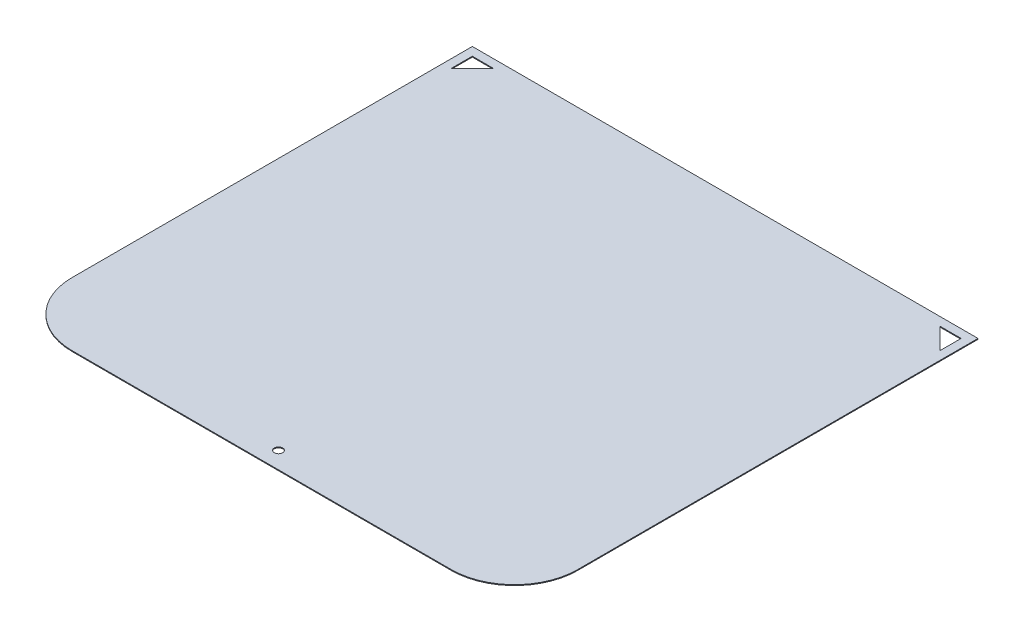
ISO-10303-21;
HEADER;
FILE_DESCRIPTION(('STEP AP214'),'2;1');
FILE_NAME('part.step','',(''),(''),'','','');
FILE_SCHEMA(('AUTOMOTIVE_DESIGN { 1 0 10303 214 1 1 1 1 }'));
ENDSEC;
DATA;
#1=APPLICATION_CONTEXT('core data for automotive mechanical design processes');
#2=APPLICATION_PROTOCOL_DEFINITION('international standard','automotive_design',2000,#1);
#3=PRODUCT_CONTEXT('',#1,'mechanical');
#4=PRODUCT('Part','Part','',(#3));
#5=PRODUCT_RELATED_PRODUCT_CATEGORY('part','',(#4));
#6=PRODUCT_DEFINITION_FORMATION('','',#4);
#7=PRODUCT_DEFINITION_CONTEXT('part definition',#1,'design');
#8=PRODUCT_DEFINITION('design','',#6,#7);
#9=PRODUCT_DEFINITION_SHAPE('','',#8);
#10=(LENGTH_UNIT() NAMED_UNIT(*) SI_UNIT(.MILLI.,.METRE.));
#11=(NAMED_UNIT(*) PLANE_ANGLE_UNIT() SI_UNIT($,.RADIAN.));
#12=(NAMED_UNIT(*) SI_UNIT($,.STERADIAN.) SOLID_ANGLE_UNIT());
#13=UNCERTAINTY_MEASURE_WITH_UNIT(LENGTH_MEASURE(1.E-05),#10,'distance_accuracy_value','');
#14=(GEOMETRIC_REPRESENTATION_CONTEXT(3) GLOBAL_UNCERTAINTY_ASSIGNED_CONTEXT((#13)) GLOBAL_UNIT_ASSIGNED_CONTEXT((#10,
#11,#12)) REPRESENTATION_CONTEXT('',''));
#15=CARTESIAN_POINT('',(0.,0.,0.));
#16=DIRECTION('',(0.,0.,1.));
#17=DIRECTION('',(1.,0.,0.));
#18=AXIS2_PLACEMENT_3D('',#15,#16,#17);
#19=CARTESIAN_POINT('',(0.,0.2,0.));
#20=DIRECTION('',(1.,0.,0.));
#21=DIRECTION('',(0.,0.,-1.));
#22=AXIS2_PLACEMENT_3D('',#19,#20,#21);
#23=PLANE('',#22);
#24=DIRECTION('',(0.,0.,1.));
#25=VECTOR('',#24,1.);
#26=CARTESIAN_POINT('',(0.,0.,0.));
#27=LINE('',#26,#25);
#28=CARTESIAN_POINT('',(0.,0.,-110.));
#29=VERTEX_POINT('',#28);
#30=CARTESIAN_POINT('',(0.,0.,-15.));
#31=VERTEX_POINT('',#30);
#32=EDGE_CURVE('E156',#29,#31,#27,.T.);
#33=ORIENTED_EDGE('',*,*,#32,.T.);
#34=DIRECTION('',(0.,-1.,0.));
#35=VECTOR('',#34,1.);
#36=CARTESIAN_POINT('',(0.,0.2,-15.));
#37=LINE('',#36,#35);
#38=CARTESIAN_POINT('',(0.,0.2,-15.));
#39=VERTEX_POINT('',#38);
#40=EDGE_CURVE('E195',#31,#39,#37,.F.);
#41=ORIENTED_EDGE('',*,*,#40,.T.);
#42=DIRECTION('',(0.,0.,1.));
#43=VECTOR('',#42,1.);
#44=CARTESIAN_POINT('',(0.,0.2,0.));
#45=LINE('',#44,#43);
#46=CARTESIAN_POINT('',(0.,0.2,-110.));
#47=VERTEX_POINT('',#46);
#48=EDGE_CURVE('E161',#47,#39,#45,.T.);
#49=ORIENTED_EDGE('',*,*,#48,.F.);
#50=DIRECTION('',(0.,-1.,0.));
#51=VECTOR('',#50,1.);
#52=CARTESIAN_POINT('',(0.,0.2,-110.));
#53=LINE('',#52,#51);
#54=EDGE_CURVE('E172',#47,#29,#53,.T.);
#55=ORIENTED_EDGE('',*,*,#54,.T.);
#56=EDGE_LOOP('',(#33,#41,#49,#55));
#57=FACE_BOUND('',#56,.T.);
#58=ADVANCED_FACE('F35',(#57),#23,.F.);
#59=CARTESIAN_POINT('',(0.,0.2,0.));
#60=DIRECTION('',(0.,0.,-1.));
#61=DIRECTION('',(-1.,0.,0.));
#62=AXIS2_PLACEMENT_3D('',#59,#60,#61);
#63=PLANE('',#62);
#64=DIRECTION('',(1.,0.,0.));
#65=VECTOR('',#64,1.);
#66=CARTESIAN_POINT('',(0.,0.2,0.));
#67=LINE('',#66,#65);
#68=CARTESIAN_POINT('',(15.,0.2,0.));
#69=VERTEX_POINT('',#68);
#70=CARTESIAN_POINT('',(105.,0.2,0.));
#71=VERTEX_POINT('',#70);
#72=EDGE_CURVE('E164',#69,#71,#67,.T.);
#73=ORIENTED_EDGE('',*,*,#72,.F.);
#74=DIRECTION('',(0.,-1.,0.));
#75=VECTOR('',#74,1.);
#76=CARTESIAN_POINT('',(15.,0.2,0.));
#77=LINE('',#76,#75);
#78=CARTESIAN_POINT('',(15.,0.,0.));
#79=VERTEX_POINT('',#78);
#80=EDGE_CURVE('E188',#69,#79,#77,.T.);
#81=ORIENTED_EDGE('',*,*,#80,.T.);
#82=DIRECTION('',(1.,0.,0.));
#83=VECTOR('',#82,1.);
#84=CARTESIAN_POINT('',(0.,0.,0.));
#85=LINE('',#84,#83);
#86=CARTESIAN_POINT('',(105.,0.,0.));
#87=VERTEX_POINT('',#86);
#88=EDGE_CURVE('E175',#79,#87,#85,.T.);
#89=ORIENTED_EDGE('',*,*,#88,.T.);
#90=DIRECTION('',(0.,-1.,0.));
#91=VECTOR('',#90,1.);
#92=CARTESIAN_POINT('',(105.,0.2,0.));
#93=LINE('',#92,#91);
#94=EDGE_CURVE('E186',#87,#71,#93,.F.);
#95=ORIENTED_EDGE('',*,*,#94,.T.);
#96=EDGE_LOOP('',(#73,#81,#89,#95));
#97=FACE_BOUND('',#96,.T.);
#98=ADVANCED_FACE('F232',(#97),#63,.F.);
#99=CARTESIAN_POINT('',(120.,0.2,0.));
#100=DIRECTION('',(-1.,0.,0.));
#101=DIRECTION('',(0.,0.,1.));
#102=AXIS2_PLACEMENT_3D('',#99,#100,#101);
#103=PLANE('',#102);
#104=DIRECTION('',(0.,0.,-1.));
#105=VECTOR('',#104,1.);
#106=CARTESIAN_POINT('',(120.,0.2,0.));
#107=LINE('',#106,#105);
#108=CARTESIAN_POINT('',(120.,0.2,-15.));
#109=VERTEX_POINT('',#108);
#110=CARTESIAN_POINT('',(120.,0.2,-110.));
#111=VERTEX_POINT('',#110);
#112=EDGE_CURVE('E168',#109,#111,#107,.T.);
#113=ORIENTED_EDGE('',*,*,#112,.F.);
#114=DIRECTION('',(0.,-1.,0.));
#115=VECTOR('',#114,1.);
#116=CARTESIAN_POINT('',(120.,0.2,-15.));
#117=LINE('',#116,#115);
#118=CARTESIAN_POINT('',(120.,0.,-15.));
#119=VERTEX_POINT('',#118);
#120=EDGE_CURVE('E201',#109,#119,#117,.T.);
#121=ORIENTED_EDGE('',*,*,#120,.T.);
#122=DIRECTION('',(0.,0.,-1.));
#123=VECTOR('',#122,1.);
#124=CARTESIAN_POINT('',(120.,0.,0.));
#125=LINE('',#124,#123);
#126=CARTESIAN_POINT('',(120.,0.,-110.));
#127=VERTEX_POINT('',#126);
#128=EDGE_CURVE('E178',#119,#127,#125,.T.);
#129=ORIENTED_EDGE('',*,*,#128,.T.);
#130=DIRECTION('',(0.,-1.,0.));
#131=VECTOR('',#130,1.);
#132=CARTESIAN_POINT('',(120.,0.2,-110.));
#133=LINE('',#132,#131);
#134=EDGE_CURVE('E183',#111,#127,#133,.T.);
#135=ORIENTED_EDGE('',*,*,#134,.F.);
#136=EDGE_LOOP('',(#113,#121,#129,#135));
#137=FACE_BOUND('',#136,.T.);
#138=ADVANCED_FACE('F241',(#137),#103,.F.);
#139=CARTESIAN_POINT('',(0.,0.2,-110.));
#140=DIRECTION('',(0.,0.,1.));
#141=DIRECTION('',(1.,0.,0.));
#142=AXIS2_PLACEMENT_3D('',#139,#140,#141);
#143=PLANE('',#142);
#144=DIRECTION('',(-1.,0.,0.));
#145=VECTOR('',#144,1.);
#146=CARTESIAN_POINT('',(0.,0.,-110.));
#147=LINE('',#146,#145);
#148=EDGE_CURVE('E165',#127,#29,#147,.T.);
#149=ORIENTED_EDGE('',*,*,#148,.T.);
#150=ORIENTED_EDGE('',*,*,#54,.F.);
#151=DIRECTION('',(-1.,0.,0.));
#152=VECTOR('',#151,1.);
#153=CARTESIAN_POINT('',(0.,0.2,-110.));
#154=LINE('',#153,#152);
#155=EDGE_CURVE('E170',#111,#47,#154,.T.);
#156=ORIENTED_EDGE('',*,*,#155,.F.);
#157=ORIENTED_EDGE('',*,*,#134,.T.);
#158=EDGE_LOOP('',(#149,#150,#156,#157));
#159=FACE_BOUND('',#158,.T.);
#160=ADVANCED_FACE('F246',(#159),#143,.F.);
#161=CARTESIAN_POINT('',(0.,0.2,0.));
#162=DIRECTION('',(0.,-1.,0.));
#163=DIRECTION('',(0.,0.,-1.));
#164=AXIS2_PLACEMENT_3D('',#161,#162,#163);
#165=PLANE('',#164);
#166=CARTESIAN_POINT('',(60.,0.2,-4.));
#167=DIRECTION('',(0.,1.,0.));
#168=DIRECTION('',(0.,0.,1.));
#169=AXIS2_PLACEMENT_3D('',#166,#167,#168);
#170=CIRCLE('',#169,0.999999999999998);
#171=CARTESIAN_POINT('',(60.,0.2,-3.));
#172=VERTEX_POINT('',#171);
#173=EDGE_CURVE('E362',#172,#172,#170,.T.);
#174=ORIENTED_EDGE('',*,*,#173,.F.);
#175=EDGE_LOOP('',(#174));
#176=FACE_BOUND('',#175,.T.);
#177=DIRECTION('',(0.,0.,-1.));
#178=VECTOR('',#177,1.);
#179=CARTESIAN_POINT('',(118.,0.2,-103.));
#180=LINE('',#179,#178);
#181=CARTESIAN_POINT('',(118.,0.2,-103.));
#182=VERTEX_POINT('',#181);
#183=CARTESIAN_POINT('',(118.,0.2,-108.));
#184=VERTEX_POINT('',#183);
#185=EDGE_CURVE('E134',#182,#184,#180,.T.);
#186=ORIENTED_EDGE('',*,*,#185,.F.);
#187=DIRECTION('',(0.707106781186547,0.,0.707106781186547));
#188=VECTOR('',#187,1.);
#189=CARTESIAN_POINT('',(113.,0.2,-108.));
#190=LINE('',#189,#188);
#191=CARTESIAN_POINT('',(113.,0.2,-108.));
#192=VERTEX_POINT('',#191);
#193=EDGE_CURVE('E51',#192,#182,#190,.T.);
#194=ORIENTED_EDGE('',*,*,#193,.F.);
#195=DIRECTION('',(-1.,0.,0.));
#196=VECTOR('',#195,1.);
#197=CARTESIAN_POINT('',(118.,0.2,-108.));
#198=LINE('',#197,#196);
#199=EDGE_CURVE('E127',#184,#192,#198,.T.);
#200=ORIENTED_EDGE('',*,*,#199,.F.);
#201=EDGE_LOOP('',(#186,#194,#200));
#202=FACE_BOUND('',#201,.T.);
#203=DIRECTION('',(0.707106781186547,0.,-0.707106781186548));
#204=VECTOR('',#203,1.);
#205=CARTESIAN_POINT('',(6.99999999999999,0.2,-108.));
#206=LINE('',#205,#204);
#207=CARTESIAN_POINT('',(2.00000000000001,0.2,-103.));
#208=VERTEX_POINT('',#207);
#209=CARTESIAN_POINT('',(6.99999999999999,0.2,-108.));
#210=VERTEX_POINT('',#209);
#211=EDGE_CURVE('E147',#208,#210,#206,.T.);
#212=ORIENTED_EDGE('',*,*,#211,.F.);
#213=DIRECTION('',(0.,0.,1.));
#214=VECTOR('',#213,1.);
#215=CARTESIAN_POINT('',(2.,0.2,-103.));
#216=LINE('',#215,#214);
#217=CARTESIAN_POINT('',(1.99999999999999,0.2,-108.));
#218=VERTEX_POINT('',#217);
#219=EDGE_CURVE('E144',#218,#208,#216,.T.);
#220=ORIENTED_EDGE('',*,*,#219,.F.);
#221=DIRECTION('',(-1.,0.,0.));
#222=VECTOR('',#221,1.);
#223=CARTESIAN_POINT('',(1.99999999999999,0.2,-108.));
#224=LINE('',#223,#222);
#225=EDGE_CURVE('E150',#210,#218,#224,.T.);
#226=ORIENTED_EDGE('',*,*,#225,.F.);
#227=EDGE_LOOP('',(#212,#220,#226));
#228=FACE_BOUND('',#227,.T.);
#229=ORIENTED_EDGE('',*,*,#48,.T.);
#230=CARTESIAN_POINT('',(15.,0.2,-15.));
#231=DIRECTION('',(0.,-1.,0.));
#232=DIRECTION('',(0.,0.,-1.));
#233=AXIS2_PLACEMENT_3D('',#230,#231,#232);
#234=CIRCLE('',#233,15.);
#235=EDGE_CURVE('E199',#39,#69,#234,.F.);
#236=ORIENTED_EDGE('',*,*,#235,.T.);
#237=ORIENTED_EDGE('',*,*,#72,.T.);
#238=CARTESIAN_POINT('',(105.,0.2,-15.));
#239=DIRECTION('',(0.,-1.,0.));
#240=DIRECTION('',(0.,0.,-1.));
#241=AXIS2_PLACEMENT_3D('',#238,#239,#240);
#242=CIRCLE('',#241,15.);
#243=EDGE_CURVE('E197',#71,#109,#242,.F.);
#244=ORIENTED_EDGE('',*,*,#243,.T.);
#245=ORIENTED_EDGE('',*,*,#112,.T.);
#246=ORIENTED_EDGE('',*,*,#155,.T.);
#247=EDGE_LOOP('',(#229,#236,#237,#244,#245,#246));
#248=FACE_BOUND('',#247,.T.);
#249=ADVANCED_FACE('F138',(#176,#202,#228,#248),#165,.F.);
#250=CARTESIAN_POINT('',(0.,0.,0.));
#251=DIRECTION('',(0.,-1.,0.));
#252=DIRECTION('',(0.,0.,-1.));
#253=AXIS2_PLACEMENT_3D('',#250,#251,#252);
#254=PLANE('',#253);
#255=CARTESIAN_POINT('',(60.,0.,-4.));
#256=DIRECTION('',(0.,-1.,0.));
#257=DIRECTION('',(0.,0.,-1.));
#258=AXIS2_PLACEMENT_3D('',#255,#256,#257);
#259=CIRCLE('',#258,0.999999999999998);
#260=CARTESIAN_POINT('',(60.,0.,-5.));
#261=VERTEX_POINT('',#260);
#262=EDGE_CURVE('E39',#261,#261,#259,.T.);
#263=ORIENTED_EDGE('',*,*,#262,.F.);
#264=EDGE_LOOP('',(#263));
#265=FACE_BOUND('',#264,.T.);
#266=DIRECTION('',(-0.707106781186548,0.,-0.707106781186548));
#267=VECTOR('',#266,1.);
#268=CARTESIAN_POINT('',(110.5,0.,-110.5));
#269=LINE('',#268,#267);
#270=CARTESIAN_POINT('',(118.,0.,-103.));
#271=VERTEX_POINT('',#270);
#272=CARTESIAN_POINT('',(113.,0.,-108.));
#273=VERTEX_POINT('',#272);
#274=EDGE_CURVE('E11',#271,#273,#269,.T.);
#275=ORIENTED_EDGE('',*,*,#274,.F.);
#276=DIRECTION('',(0.,0.,1.));
#277=VECTOR('',#276,1.);
#278=CARTESIAN_POINT('',(118.,0.,-3.27515792264422E-13));
#279=LINE('',#278,#277);
#280=CARTESIAN_POINT('',(118.,0.,-108.));
#281=VERTEX_POINT('',#280);
#282=EDGE_CURVE('E211',#281,#271,#279,.T.);
#283=ORIENTED_EDGE('',*,*,#282,.F.);
#284=DIRECTION('',(1.,0.,0.));
#285=VECTOR('',#284,1.);
#286=CARTESIAN_POINT('',(0.,0.,-108.));
#287=LINE('',#286,#285);
#288=EDGE_CURVE('E44',#273,#281,#287,.T.);
#289=ORIENTED_EDGE('',*,*,#288,.F.);
#290=EDGE_LOOP('',(#275,#283,#289));
#291=FACE_BOUND('',#290,.T.);
#292=DIRECTION('',(0.,0.,-1.));
#293=VECTOR('',#292,1.);
#294=CARTESIAN_POINT('',(2.00000000000004,0.,0.));
#295=LINE('',#294,#293);
#296=CARTESIAN_POINT('',(2.,0.,-103.));
#297=VERTEX_POINT('',#296);
#298=CARTESIAN_POINT('',(1.99999999999999,0.,-108.));
#299=VERTEX_POINT('',#298);
#300=EDGE_CURVE('E209',#297,#299,#295,.T.);
#301=ORIENTED_EDGE('',*,*,#300,.F.);
#302=DIRECTION('',(-0.707106781186547,0.,0.707106781186548));
#303=VECTOR('',#302,1.);
#304=CARTESIAN_POINT('',(-50.5,0.,-50.4999999999999));
#305=LINE('',#304,#303);
#306=CARTESIAN_POINT('',(6.99999999999999,0.,-108.));
#307=VERTEX_POINT('',#306);
#308=EDGE_CURVE('E204',#307,#297,#305,.T.);
#309=ORIENTED_EDGE('',*,*,#308,.F.);
#310=DIRECTION('',(1.,0.,0.));
#311=VECTOR('',#310,1.);
#312=CARTESIAN_POINT('',(0.,0.,-108.));
#313=LINE('',#312,#311);
#314=EDGE_CURVE('E206',#299,#307,#313,.T.);
#315=ORIENTED_EDGE('',*,*,#314,.F.);
#316=EDGE_LOOP('',(#301,#309,#315));
#317=FACE_BOUND('',#316,.T.);
#318=ORIENTED_EDGE('',*,*,#88,.F.);
#319=CARTESIAN_POINT('',(15.,0.,-15.));
#320=DIRECTION('',(0.,-1.,0.));
#321=DIRECTION('',(0.,0.,-1.));
#322=AXIS2_PLACEMENT_3D('',#319,#320,#321);
#323=CIRCLE('',#322,15.);
#324=EDGE_CURVE('E193',#79,#31,#323,.T.);
#325=ORIENTED_EDGE('',*,*,#324,.T.);
#326=ORIENTED_EDGE('',*,*,#32,.F.);
#327=ORIENTED_EDGE('',*,*,#148,.F.);
#328=ORIENTED_EDGE('',*,*,#128,.F.);
#329=CARTESIAN_POINT('',(105.,0.,-15.));
#330=DIRECTION('',(0.,-1.,0.));
#331=DIRECTION('',(0.,0.,-1.));
#332=AXIS2_PLACEMENT_3D('',#329,#330,#331);
#333=CIRCLE('',#332,15.);
#334=EDGE_CURVE('E191',#119,#87,#333,.T.);
#335=ORIENTED_EDGE('',*,*,#334,.T.);
#336=EDGE_LOOP('',(#318,#325,#326,#327,#328,#335));
#337=FACE_BOUND('',#336,.T.);
#338=ADVANCED_FACE('F216',(#265,#291,#317,#337),#254,.T.);
#339=CARTESIAN_POINT('',(15.,0.2,-15.));
#340=DIRECTION('',(0.,-1.,0.));
#341=DIRECTION('',(0.,0.,-1.));
#342=AXIS2_PLACEMENT_3D('',#339,#340,#341);
#343=CYLINDRICAL_SURFACE('',#342,15.);
#344=ORIENTED_EDGE('',*,*,#235,.F.);
#345=ORIENTED_EDGE('',*,*,#40,.F.);
#346=ORIENTED_EDGE('',*,*,#324,.F.);
#347=ORIENTED_EDGE('',*,*,#80,.F.);
#348=EDGE_LOOP('',(#344,#345,#346,#347));
#349=FACE_BOUND('',#348,.T.);
#350=ADVANCED_FACE('F219',(#349),#343,.T.);
#351=CARTESIAN_POINT('',(105.,0.2,-15.));
#352=DIRECTION('',(0.,-1.,0.));
#353=DIRECTION('',(0.,0.,-1.));
#354=AXIS2_PLACEMENT_3D('',#351,#352,#353);
#355=CYLINDRICAL_SURFACE('',#354,15.);
#356=ORIENTED_EDGE('',*,*,#243,.F.);
#357=ORIENTED_EDGE('',*,*,#94,.F.);
#358=ORIENTED_EDGE('',*,*,#334,.F.);
#359=ORIENTED_EDGE('',*,*,#120,.F.);
#360=EDGE_LOOP('',(#356,#357,#358,#359));
#361=FACE_BOUND('',#360,.T.);
#362=ADVANCED_FACE('F37',(#361),#355,.T.);
#363=CARTESIAN_POINT('',(2.,-4.8,-103.));
#364=DIRECTION('',(-1.,0.,0.));
#365=DIRECTION('',(0.,0.,1.));
#366=AXIS2_PLACEMENT_3D('',#363,#364,#365);
#367=PLANE('',#366);
#368=ORIENTED_EDGE('',*,*,#300,.T.);
#369=DIRECTION('',(0.,1.,0.));
#370=VECTOR('',#369,1.);
#371=CARTESIAN_POINT('',(1.99999999999999,-4.8,-108.));
#372=LINE('',#371,#370);
#373=EDGE_CURVE('E154',#299,#218,#372,.T.);
#374=ORIENTED_EDGE('',*,*,#373,.T.);
#375=ORIENTED_EDGE('',*,*,#219,.T.);
#376=DIRECTION('',(0.,1.,0.));
#377=VECTOR('',#376,1.);
#378=CARTESIAN_POINT('',(2.,-4.8,-103.));
#379=LINE('',#378,#377);
#380=EDGE_CURVE('E153',#297,#208,#379,.T.);
#381=ORIENTED_EDGE('',*,*,#380,.F.);
#382=EDGE_LOOP('',(#368,#374,#375,#381));
#383=FACE_BOUND('',#382,.T.);
#384=ADVANCED_FACE('F263',(#383),#367,.F.);
#385=CARTESIAN_POINT('',(1.99999999999999,-4.8,-108.));
#386=DIRECTION('',(0.,0.,-1.));
#387=DIRECTION('',(-1.,0.,0.));
#388=AXIS2_PLACEMENT_3D('',#385,#386,#387);
#389=PLANE('',#388);
#390=ORIENTED_EDGE('',*,*,#314,.T.);
#391=DIRECTION('',(0.,1.,0.));
#392=VECTOR('',#391,1.);
#393=CARTESIAN_POINT('',(6.99999999999999,-4.8,-108.));
#394=LINE('',#393,#392);
#395=EDGE_CURVE('E157',#307,#210,#394,.T.);
#396=ORIENTED_EDGE('',*,*,#395,.T.);
#397=ORIENTED_EDGE('',*,*,#225,.T.);
#398=ORIENTED_EDGE('',*,*,#373,.F.);
#399=EDGE_LOOP('',(#390,#396,#397,#398));
#400=FACE_BOUND('',#399,.T.);
#401=ADVANCED_FACE('F267',(#400),#389,.F.);
#402=CARTESIAN_POINT('',(6.99999999999999,-4.8,-108.));
#403=DIRECTION('',(0.707106781186548,0.,0.707106781186547));
#404=DIRECTION('',(0.707106781186547,0.,-0.707106781186548));
#405=AXIS2_PLACEMENT_3D('',#402,#403,#404);
#406=PLANE('',#405);
#407=ORIENTED_EDGE('',*,*,#308,.T.);
#408=ORIENTED_EDGE('',*,*,#380,.T.);
#409=ORIENTED_EDGE('',*,*,#211,.T.);
#410=ORIENTED_EDGE('',*,*,#395,.F.);
#411=EDGE_LOOP('',(#407,#408,#409,#410));
#412=FACE_BOUND('',#411,.T.);
#413=ADVANCED_FACE('F273',(#412),#406,.F.);
#414=CARTESIAN_POINT('',(113.,-4.8,-108.));
#415=DIRECTION('',(-0.707106781186548,0.,0.707106781186548));
#416=DIRECTION('',(0.707106781186548,0.,0.707106781186548));
#417=AXIS2_PLACEMENT_3D('',#414,#415,#416);
#418=PLANE('',#417);
#419=ORIENTED_EDGE('',*,*,#274,.T.);
#420=DIRECTION('',(0.,1.,0.));
#421=VECTOR('',#420,1.);
#422=CARTESIAN_POINT('',(113.,-4.8,-108.));
#423=LINE('',#422,#421);
#424=EDGE_CURVE('E130',#273,#192,#423,.T.);
#425=ORIENTED_EDGE('',*,*,#424,.T.);
#426=ORIENTED_EDGE('',*,*,#193,.T.);
#427=DIRECTION('',(0.,1.,0.));
#428=VECTOR('',#427,1.);
#429=CARTESIAN_POINT('',(118.,-4.8,-103.));
#430=LINE('',#429,#428);
#431=EDGE_CURVE('E131',#271,#182,#430,.T.);
#432=ORIENTED_EDGE('',*,*,#431,.F.);
#433=EDGE_LOOP('',(#419,#425,#426,#432));
#434=FACE_BOUND('',#433,.T.);
#435=ADVANCED_FACE('F215',(#434),#418,.F.);
#436=CARTESIAN_POINT('',(118.,-4.8,-108.));
#437=DIRECTION('',(0.,0.,-1.));
#438=DIRECTION('',(-1.,0.,0.));
#439=AXIS2_PLACEMENT_3D('',#436,#437,#438);
#440=PLANE('',#439);
#441=ORIENTED_EDGE('',*,*,#288,.T.);
#442=DIRECTION('',(0.,1.,0.));
#443=VECTOR('',#442,1.);
#444=CARTESIAN_POINT('',(118.,-4.8,-108.));
#445=LINE('',#444,#443);
#446=EDGE_CURVE('E59',#281,#184,#445,.T.);
#447=ORIENTED_EDGE('',*,*,#446,.T.);
#448=ORIENTED_EDGE('',*,*,#199,.T.);
#449=ORIENTED_EDGE('',*,*,#424,.F.);
#450=EDGE_LOOP('',(#441,#447,#448,#449));
#451=FACE_BOUND('',#450,.T.);
#452=ADVANCED_FACE('F124',(#451),#440,.F.);
#453=CARTESIAN_POINT('',(118.,-4.8,-103.));
#454=DIRECTION('',(1.,0.,0.));
#455=DIRECTION('',(0.,0.,-1.));
#456=AXIS2_PLACEMENT_3D('',#453,#454,#455);
#457=PLANE('',#456);
#458=ORIENTED_EDGE('',*,*,#282,.T.);
#459=ORIENTED_EDGE('',*,*,#431,.T.);
#460=ORIENTED_EDGE('',*,*,#185,.T.);
#461=ORIENTED_EDGE('',*,*,#446,.F.);
#462=EDGE_LOOP('',(#458,#459,#460,#461));
#463=FACE_BOUND('',#462,.T.);
#464=ADVANCED_FACE('F135',(#463),#457,.F.);
#465=CARTESIAN_POINT('',(60.,-4.8,-4.));
#466=DIRECTION('',(0.,1.,0.));
#467=DIRECTION('',(0.,0.,1.));
#468=AXIS2_PLACEMENT_3D('',#465,#466,#467);
#469=CYLINDRICAL_SURFACE('',#468,0.999999999999998);
#470=ORIENTED_EDGE('',*,*,#262,.T.);
#471=EDGE_LOOP('',(#470));
#472=FACE_BOUND('',#471,.T.);
#473=ORIENTED_EDGE('',*,*,#173,.T.);
#474=EDGE_LOOP('',(#473));
#475=FACE_BOUND('',#474,.T.);
#476=ADVANCED_FACE('F344',(#472,#475),#469,.F.);
#477=CLOSED_SHELL('',(#58,#98,#138,#160,#249,#338,#350,#362,#384,#401,#413,#435,#452,#464,#476));
#478=MANIFOLD_SOLID_BREP('B2',#477);
#479=ADVANCED_BREP_SHAPE_REPRESENTATION('',(#18,#478),#14);
#480=SHAPE_DEFINITION_REPRESENTATION(#9,#479);
ENDSEC;
END-ISO-10303-21;
